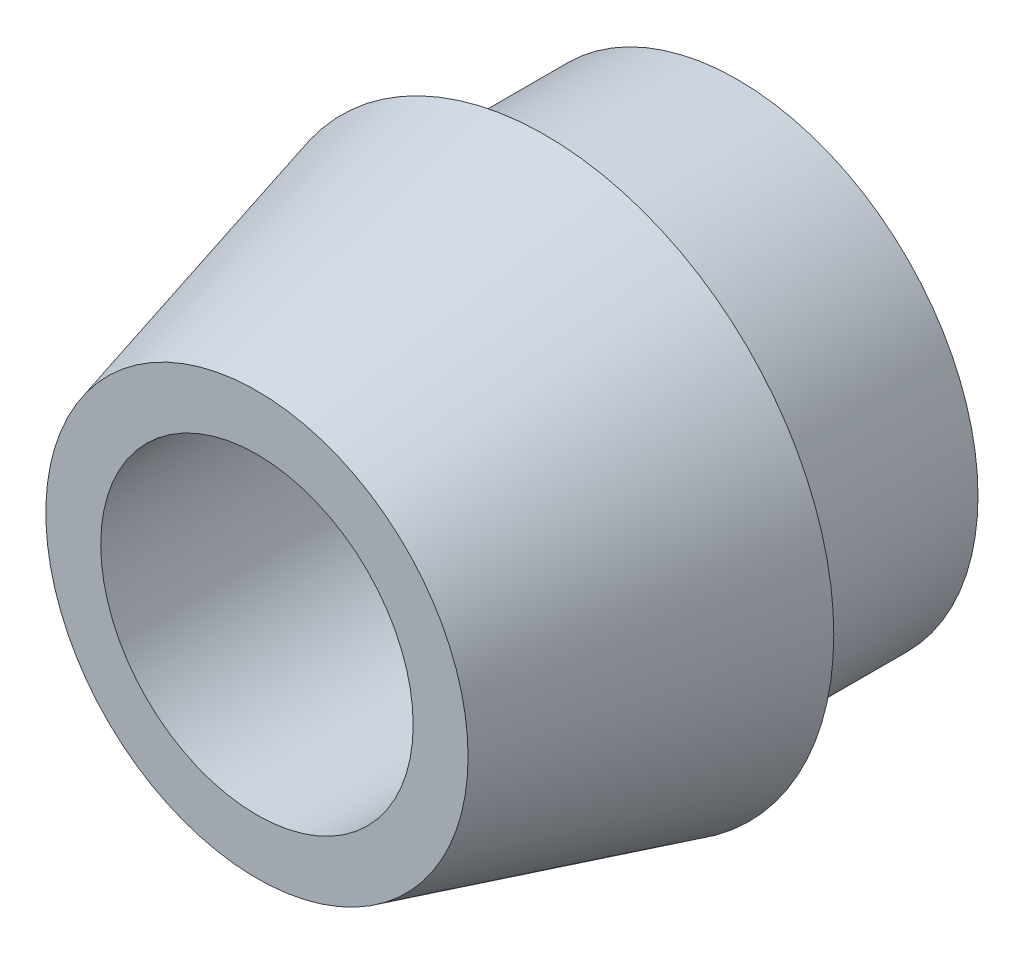
ISO-10303-21;
HEADER;
FILE_DESCRIPTION(('STEP AP214'),'2;1');
FILE_NAME('part.step','',(''),(''),'','','');
FILE_SCHEMA(('AUTOMOTIVE_DESIGN { 1 0 10303 214 1 1 1 1 }'));
ENDSEC;
DATA;
#1=APPLICATION_CONTEXT('core data for automotive mechanical design processes');
#2=APPLICATION_PROTOCOL_DEFINITION('international standard','automotive_design',2000,#1);
#3=PRODUCT_CONTEXT('',#1,'mechanical');
#4=PRODUCT('Part','Part','',(#3));
#5=PRODUCT_RELATED_PRODUCT_CATEGORY('part','',(#4));
#6=PRODUCT_DEFINITION_FORMATION('','',#4);
#7=PRODUCT_DEFINITION_CONTEXT('part definition',#1,'design');
#8=PRODUCT_DEFINITION('design','',#6,#7);
#9=PRODUCT_DEFINITION_SHAPE('','',#8);
#10=(LENGTH_UNIT() NAMED_UNIT(*) SI_UNIT(.MILLI.,.METRE.));
#11=(NAMED_UNIT(*) PLANE_ANGLE_UNIT() SI_UNIT($,.RADIAN.));
#12=(NAMED_UNIT(*) SI_UNIT($,.STERADIAN.) SOLID_ANGLE_UNIT());
#13=UNCERTAINTY_MEASURE_WITH_UNIT(LENGTH_MEASURE(1.E-05),#10,'distance_accuracy_value','');
#14=(GEOMETRIC_REPRESENTATION_CONTEXT(3) GLOBAL_UNCERTAINTY_ASSIGNED_CONTEXT((#13)) GLOBAL_UNIT_ASSIGNED_CONTEXT((#10,
#11,#12)) REPRESENTATION_CONTEXT('',''));
#15=CARTESIAN_POINT('',(0.,0.,0.));
#16=DIRECTION('',(0.,0.,1.));
#17=DIRECTION('',(1.,0.,0.));
#18=AXIS2_PLACEMENT_3D('',#15,#16,#17);
#19=CARTESIAN_POINT('',(0.,0.,0.));
#20=DIRECTION('',(0.,0.,1.));
#21=DIRECTION('',(1.,0.,0.));
#22=AXIS2_PLACEMENT_3D('',#19,#20,#21);
#23=PLANE('',#22);
#24=CARTESIAN_POINT('',(0.,0.,0.));
#25=DIRECTION('',(0.,0.,1.));
#26=DIRECTION('',(1.,0.,0.));
#27=AXIS2_PLACEMENT_3D('',#24,#25,#26);
#28=CIRCLE('',#27,50.);
#29=CARTESIAN_POINT('',(50.,0.,0.));
#30=VERTEX_POINT('',#29);
#31=EDGE_CURVE('E47',#30,#30,#28,.T.);
#32=ORIENTED_EDGE('',*,*,#31,.F.);
#33=EDGE_LOOP('',(#32));
#34=FACE_BOUND('',#33,.T.);
#35=CARTESIAN_POINT('',(0.,0.,0.));
#36=DIRECTION('',(0.,0.,1.));
#37=DIRECTION('',(1.,0.,0.));
#38=AXIS2_PLACEMENT_3D('',#35,#36,#37);
#39=CIRCLE('',#38,35.);
#40=CARTESIAN_POINT('',(35.,0.,0.));
#41=VERTEX_POINT('',#40);
#42=EDGE_CURVE('E56',#41,#41,#39,.T.);
#43=ORIENTED_EDGE('',*,*,#42,.T.);
#44=EDGE_LOOP('',(#43));
#45=FACE_BOUND('',#44,.T.);
#46=ADVANCED_FACE('F43',(#34,#45),#23,.F.);
#47=CARTESIAN_POINT('',(0.,0.,40.));
#48=DIRECTION('',(0.,0.,-1.));
#49=DIRECTION('',(-1.,0.,0.));
#50=AXIS2_PLACEMENT_3D('',#47,#48,#49);
#51=CYLINDRICAL_SURFACE('',#50,50.);
#52=CARTESIAN_POINT('',(0.,0.,40.));
#53=DIRECTION('',(0.,0.,1.));
#54=DIRECTION('',(1.,0.,0.));
#55=AXIS2_PLACEMENT_3D('',#52,#53,#54);
#56=CIRCLE('',#55,50.);
#57=CARTESIAN_POINT('',(50.,0.,40.));
#58=VERTEX_POINT('',#57);
#59=EDGE_CURVE('E10',#58,#58,#56,.T.);
#60=ORIENTED_EDGE('',*,*,#59,.F.);
#61=EDGE_LOOP('',(#60));
#62=FACE_BOUND('',#61,.T.);
#63=ORIENTED_EDGE('',*,*,#31,.T.);
#64=EDGE_LOOP('',(#63));
#65=FACE_BOUND('',#64,.T.);
#66=ADVANCED_FACE('F45',(#62,#65),#51,.T.);
#67=CARTESIAN_POINT('',(0.,0.,40.));
#68=DIRECTION('',(0.,0.,-1.));
#69=DIRECTION('',(-1.,0.,0.));
#70=AXIS2_PLACEMENT_3D('',#67,#68,#69);
#71=CYLINDRICAL_SURFACE('',#70,35.);
#72=CARTESIAN_POINT('',(0.,0.,40.));
#73=DIRECTION('',(0.,0.,1.));
#74=DIRECTION('',(1.,0.,0.));
#75=AXIS2_PLACEMENT_3D('',#72,#73,#74);
#76=CIRCLE('',#75,35.);
#77=CARTESIAN_POINT('',(35.,0.,40.));
#78=VERTEX_POINT('',#77);
#79=EDGE_CURVE('E61',#78,#78,#76,.T.);
#80=ORIENTED_EDGE('',*,*,#79,.T.);
#81=EDGE_LOOP('',(#80));
#82=FACE_BOUND('',#81,.T.);
#83=ORIENTED_EDGE('',*,*,#42,.F.);
#84=EDGE_LOOP('',(#83));
#85=FACE_BOUND('',#84,.T.);
#86=ADVANCED_FACE('F106',(#82,#85),#71,.F.);
#87=CARTESIAN_POINT('',(0.,0.,40.));
#88=DIRECTION('',(0.,0.,1.));
#89=DIRECTION('',(1.,0.,0.));
#90=AXIS2_PLACEMENT_3D('',#87,#88,#89);
#91=PLANE('',#90);
#92=CARTESIAN_POINT('',(0.,0.,40.));
#93=DIRECTION('',(0.,0.,1.));
#94=DIRECTION('',(1.,0.,0.));
#95=AXIS2_PLACEMENT_3D('',#92,#93,#94);
#96=CIRCLE('',#95,32.5);
#97=CARTESIAN_POINT('',(32.5,0.,40.));
#98=VERTEX_POINT('',#97);
#99=EDGE_CURVE('E73',#98,#98,#96,.T.);
#100=ORIENTED_EDGE('',*,*,#99,.T.);
#101=EDGE_LOOP('',(#100));
#102=FACE_BOUND('',#101,.T.);
#103=ORIENTED_EDGE('',*,*,#79,.F.);
#104=EDGE_LOOP('',(#103));
#105=FACE_BOUND('',#104,.T.);
#106=ADVANCED_FACE('F95',(#102,#105),#91,.F.);
#107=CARTESIAN_POINT('',(0.,0.,40.));
#108=DIRECTION('',(0.,0.,-1.));
#109=DIRECTION('',(1.,0.,0.));
#110=AXIS2_PLACEMENT_3D('',#107,#108,#109);
#111=CONICAL_SURFACE('',#110,60.,0.26179938779915);
#112=CARTESIAN_POINT('',(0.,0.,100.));
#113=DIRECTION('',(0.,0.,1.));
#114=DIRECTION('',(1.,0.,0.));
#115=AXIS2_PLACEMENT_3D('',#112,#113,#114);
#116=CIRCLE('',#115,43.9230484541326);
#117=CARTESIAN_POINT('',(43.9230484541326,0.,100.));
#118=VERTEX_POINT('',#117);
#119=EDGE_CURVE('E65',#118,#118,#116,.T.);
#120=ORIENTED_EDGE('',*,*,#119,.F.);
#121=EDGE_LOOP('',(#120));
#122=FACE_BOUND('',#121,.T.);
#123=CARTESIAN_POINT('',(0.,0.,40.));
#124=DIRECTION('',(0.,0.,1.));
#125=DIRECTION('',(1.,0.,0.));
#126=AXIS2_PLACEMENT_3D('',#123,#124,#125);
#127=CIRCLE('',#126,60.);
#128=CARTESIAN_POINT('',(60.,0.,40.));
#129=VERTEX_POINT('',#128);
#130=EDGE_CURVE('E69',#129,#129,#127,.T.);
#131=ORIENTED_EDGE('',*,*,#130,.T.);
#132=EDGE_LOOP('',(#131));
#133=FACE_BOUND('',#132,.T.);
#134=ADVANCED_FACE('F89',(#122,#133),#111,.T.);
#135=CARTESIAN_POINT('',(0.,0.,100.));
#136=DIRECTION('',(0.,0.,1.));
#137=DIRECTION('',(1.,0.,0.));
#138=AXIS2_PLACEMENT_3D('',#135,#136,#137);
#139=PLANE('',#138);
#140=CARTESIAN_POINT('',(0.,0.,100.));
#141=DIRECTION('',(0.,0.,1.));
#142=DIRECTION('',(1.,0.,0.));
#143=AXIS2_PLACEMENT_3D('',#140,#141,#142);
#144=CIRCLE('',#143,32.5);
#145=CARTESIAN_POINT('',(32.5,0.,100.));
#146=VERTEX_POINT('',#145);
#147=EDGE_CURVE('E77',#146,#146,#144,.T.);
#148=ORIENTED_EDGE('',*,*,#147,.F.);
#149=EDGE_LOOP('',(#148));
#150=FACE_BOUND('',#149,.T.);
#151=ORIENTED_EDGE('',*,*,#119,.T.);
#152=EDGE_LOOP('',(#151));
#153=FACE_BOUND('',#152,.T.);
#154=ADVANCED_FACE('F85',(#150,#153),#139,.T.);
#155=ORIENTED_EDGE('',*,*,#59,.T.);
#156=EDGE_LOOP('',(#155));
#157=FACE_BOUND('',#156,.T.);
#158=ORIENTED_EDGE('',*,*,#130,.F.);
#159=EDGE_LOOP('',(#158));
#160=FACE_BOUND('',#159,.T.);
#161=ADVANCED_FACE('F88',(#157,#160),#91,.F.);
#162=CARTESIAN_POINT('',(0.,0.,0.));
#163=DIRECTION('',(0.,0.,1.));
#164=DIRECTION('',(1.,0.,0.));
#165=AXIS2_PLACEMENT_3D('',#162,#163,#164);
#166=CYLINDRICAL_SURFACE('',#165,32.5);
#167=ORIENTED_EDGE('',*,*,#147,.T.);
#168=EDGE_LOOP('',(#167));
#169=FACE_BOUND('',#168,.T.);
#170=ORIENTED_EDGE('',*,*,#99,.F.);
#171=EDGE_LOOP('',(#170));
#172=FACE_BOUND('',#171,.T.);
#173=ADVANCED_FACE('F82',(#169,#172),#166,.F.);
#174=CLOSED_SHELL('',(#46,#66,#86,#106,#134,#154,#161,#173));
#175=MANIFOLD_SOLID_BREP('B2',#174);
#176=ADVANCED_BREP_SHAPE_REPRESENTATION('',(#18,#175),#14);
#177=SHAPE_DEFINITION_REPRESENTATION(#9,#176);
ENDSEC;
END-ISO-10303-21;
